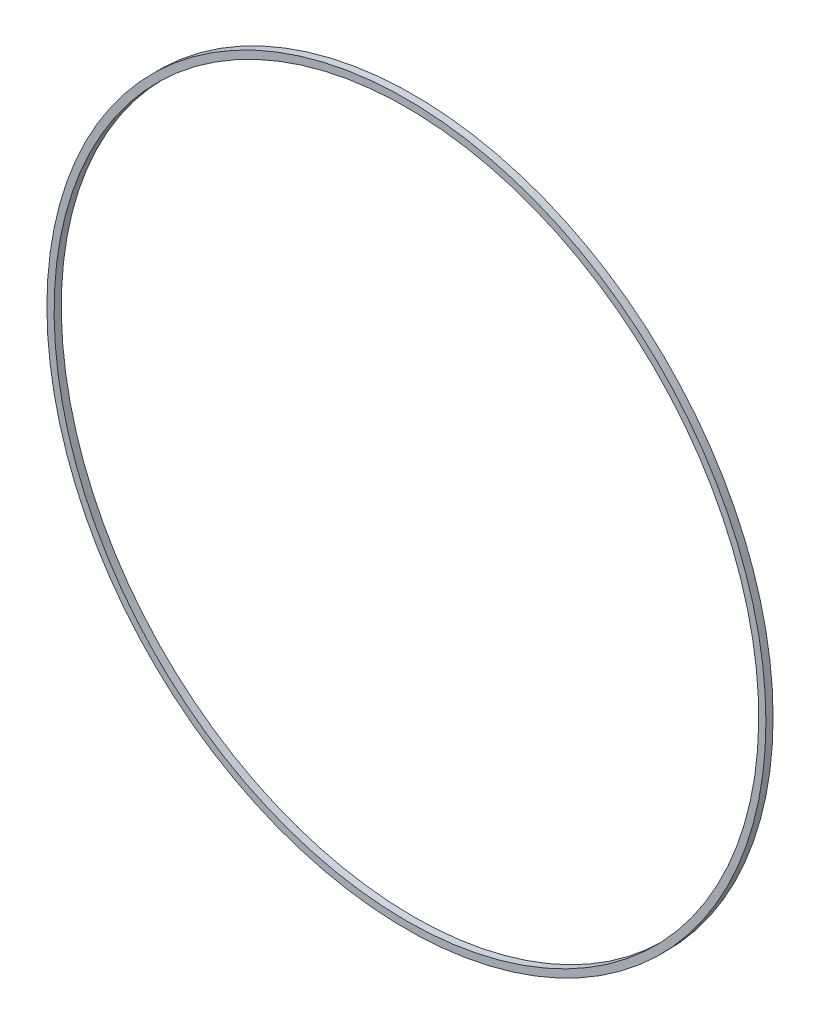
ISO-10303-21;
HEADER;
FILE_DESCRIPTION(('STEP AP214'),'2;1');
FILE_NAME('part.step','',(''),(''),'','','');
FILE_SCHEMA(('AUTOMOTIVE_DESIGN { 1 0 10303 214 1 1 1 1 }'));
ENDSEC;
DATA;
#1=APPLICATION_CONTEXT('core data for automotive mechanical design processes');
#2=APPLICATION_PROTOCOL_DEFINITION('international standard','automotive_design',2000,#1);
#3=PRODUCT_CONTEXT('',#1,'mechanical');
#4=PRODUCT('Part','Part','',(#3));
#5=PRODUCT_RELATED_PRODUCT_CATEGORY('part','',(#4));
#6=PRODUCT_DEFINITION_FORMATION('','',#4);
#7=PRODUCT_DEFINITION_CONTEXT('part definition',#1,'design');
#8=PRODUCT_DEFINITION('design','',#6,#7);
#9=PRODUCT_DEFINITION_SHAPE('','',#8);
#10=(LENGTH_UNIT() NAMED_UNIT(*) SI_UNIT(.MILLI.,.METRE.));
#11=(NAMED_UNIT(*) PLANE_ANGLE_UNIT() SI_UNIT($,.RADIAN.));
#12=(NAMED_UNIT(*) SI_UNIT($,.STERADIAN.) SOLID_ANGLE_UNIT());
#13=UNCERTAINTY_MEASURE_WITH_UNIT(LENGTH_MEASURE(1.E-05),#10,'distance_accuracy_value','');
#14=(GEOMETRIC_REPRESENTATION_CONTEXT(3) GLOBAL_UNCERTAINTY_ASSIGNED_CONTEXT((#13)) GLOBAL_UNIT_ASSIGNED_CONTEXT((#10,
#11,#12)) REPRESENTATION_CONTEXT('',''));
#15=CARTESIAN_POINT('',(0.,0.,0.));
#16=DIRECTION('',(0.,0.,1.));
#17=DIRECTION('',(1.,0.,0.));
#18=AXIS2_PLACEMENT_3D('',#15,#16,#17);
#19=CARTESIAN_POINT('',(0.,0.,-0.5));
#20=DIRECTION('',(0.,0.,1.));
#21=DIRECTION('',(1.,0.,0.));
#22=AXIS2_PLACEMENT_3D('',#19,#20,#21);
#23=PLANE('',#22);
#24=CARTESIAN_POINT('',(0.,0.,-0.5));
#25=DIRECTION('',(0.,0.,1.));
#26=DIRECTION('',(1.,0.,0.));
#27=AXIS2_PLACEMENT_3D('',#24,#25,#26);
#28=CIRCLE('',#27,48.99999481);
#29=CARTESIAN_POINT('',(48.99999481,0.,-0.5));
#30=VERTEX_POINT('',#29);
#31=EDGE_CURVE('E18',#30,#30,#28,.F.);
#32=ORIENTED_EDGE('',*,*,#31,.F.);
#33=EDGE_LOOP('',(#32));
#34=FACE_BOUND('',#33,.T.);
#35=CARTESIAN_POINT('',(0.,0.,-0.5));
#36=DIRECTION('',(0.,0.,1.));
#37=DIRECTION('',(1.,0.,0.));
#38=AXIS2_PLACEMENT_3D('',#35,#36,#37);
#39=CIRCLE('',#38,49.99999481);
#40=CARTESIAN_POINT('',(49.99999481,0.,-0.5));
#41=VERTEX_POINT('',#40);
#42=EDGE_CURVE('E27',#41,#41,#39,.F.);
#43=ORIENTED_EDGE('',*,*,#42,.T.);
#44=EDGE_LOOP('',(#43));
#45=FACE_BOUND('',#44,.T.);
#46=ADVANCED_FACE('F15',(#34,#45),#23,.F.);
#47=CARTESIAN_POINT('',(0.,0.,-0.5));
#48=DIRECTION('',(0.,0.,1.));
#49=DIRECTION('',(1.,0.,0.));
#50=AXIS2_PLACEMENT_3D('',#47,#48,#49);
#51=CYLINDRICAL_SURFACE('',#50,49.99999481);
#52=CARTESIAN_POINT('',(0.,0.,0.5));
#53=DIRECTION('',(0.,0.,1.));
#54=DIRECTION('',(1.,0.,0.));
#55=AXIS2_PLACEMENT_3D('',#52,#53,#54);
#56=CIRCLE('',#55,49.99999481);
#57=CARTESIAN_POINT('',(49.99999481,0.,0.5));
#58=VERTEX_POINT('',#57);
#59=EDGE_CURVE('E22',#58,#58,#56,.F.);
#60=ORIENTED_EDGE('',*,*,#59,.T.);
#61=EDGE_LOOP('',(#60));
#62=FACE_BOUND('',#61,.T.);
#63=ORIENTED_EDGE('',*,*,#42,.F.);
#64=EDGE_LOOP('',(#63));
#65=FACE_BOUND('',#64,.T.);
#66=ADVANCED_FACE('F38',(#62,#65),#51,.T.);
#67=CARTESIAN_POINT('',(0.,0.,0.1188006105));
#68=DIRECTION('',(0.,0.,1.));
#69=DIRECTION('',(0.,-1.,0.));
#70=AXIS2_PLACEMENT_3D('',#67,#68,#69);
#71=CYLINDRICAL_SURFACE('',#70,48.99999481);
#72=ORIENTED_EDGE('',*,*,#31,.T.);
#73=EDGE_LOOP('',(#72));
#74=FACE_BOUND('',#73,.T.);
#75=CARTESIAN_POINT('',(0.,0.,0.5));
#76=DIRECTION('',(0.,0.,1.));
#77=DIRECTION('',(0.,-1.,0.));
#78=AXIS2_PLACEMENT_3D('',#75,#76,#77);
#79=CIRCLE('',#78,48.99999481);
#80=CARTESIAN_POINT('',(0.,-48.99999481,0.5));
#81=VERTEX_POINT('',#80);
#82=EDGE_CURVE('E10',#81,#81,#79,.T.);
#83=ORIENTED_EDGE('',*,*,#82,.T.);
#84=EDGE_LOOP('',(#83));
#85=FACE_BOUND('',#84,.T.);
#86=ADVANCED_FACE('F35',(#74,#85),#71,.F.);
#87=CARTESIAN_POINT('',(0.,0.,0.5));
#88=DIRECTION('',(0.,0.,1.));
#89=DIRECTION('',(1.,0.,0.));
#90=AXIS2_PLACEMENT_3D('',#87,#88,#89);
#91=PLANE('',#90);
#92=ORIENTED_EDGE('',*,*,#82,.F.);
#93=EDGE_LOOP('',(#92));
#94=FACE_BOUND('',#93,.T.);
#95=ORIENTED_EDGE('',*,*,#59,.F.);
#96=EDGE_LOOP('',(#95));
#97=FACE_BOUND('',#96,.T.);
#98=ADVANCED_FACE('F44',(#94,#97),#91,.T.);
#99=CLOSED_SHELL('',(#46,#66,#86,#98));
#100=MANIFOLD_SOLID_BREP('B1',#99);
#101=ADVANCED_BREP_SHAPE_REPRESENTATION('',(#18,#100),#14);
#102=SHAPE_DEFINITION_REPRESENTATION(#9,#101);
ENDSEC;
END-ISO-10303-21;
